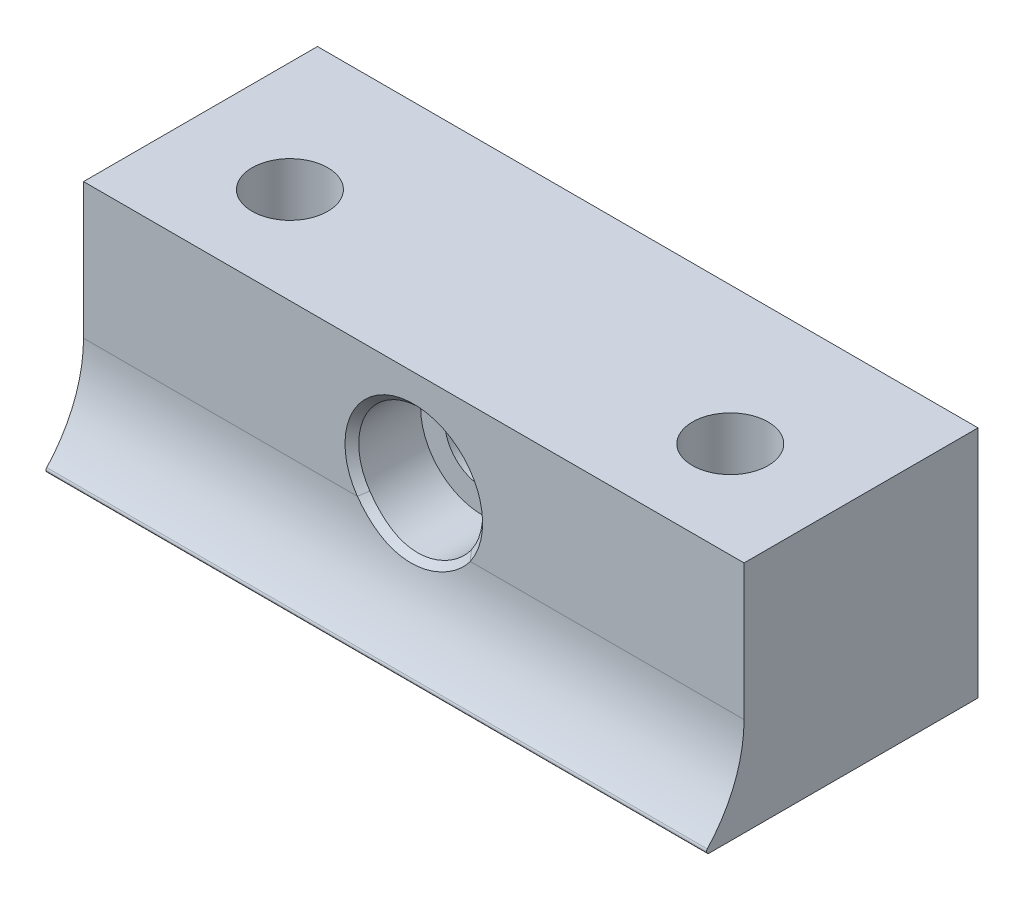
ISO-10303-21;
HEADER;
FILE_DESCRIPTION(('STEP AP214'),'2;1');
FILE_NAME('part.step','',(''),(''),'','','');
FILE_SCHEMA(('AUTOMOTIVE_DESIGN { 1 0 10303 214 1 1 1 1 }'));
ENDSEC;
DATA;
#1=APPLICATION_CONTEXT('core data for automotive mechanical design processes');
#2=APPLICATION_PROTOCOL_DEFINITION('international standard','automotive_design',2000,#1);
#3=PRODUCT_CONTEXT('',#1,'mechanical');
#4=PRODUCT('Part','Part','',(#3));
#5=PRODUCT_RELATED_PRODUCT_CATEGORY('part','',(#4));
#6=PRODUCT_DEFINITION_FORMATION('','',#4);
#7=PRODUCT_DEFINITION_CONTEXT('part definition',#1,'design');
#8=PRODUCT_DEFINITION('design','',#6,#7);
#9=PRODUCT_DEFINITION_SHAPE('','',#8);
#10=(LENGTH_UNIT() NAMED_UNIT(*) SI_UNIT(.MILLI.,.METRE.));
#11=(NAMED_UNIT(*) PLANE_ANGLE_UNIT() SI_UNIT($,.RADIAN.));
#12=(NAMED_UNIT(*) SI_UNIT($,.STERADIAN.) SOLID_ANGLE_UNIT());
#13=UNCERTAINTY_MEASURE_WITH_UNIT(LENGTH_MEASURE(1.E-05),#10,'distance_accuracy_value','');
#14=(GEOMETRIC_REPRESENTATION_CONTEXT(3) GLOBAL_UNCERTAINTY_ASSIGNED_CONTEXT((#13)) GLOBAL_UNIT_ASSIGNED_CONTEXT((#10,
#11,#12)) REPRESENTATION_CONTEXT('',''));
#15=CARTESIAN_POINT('',(0.,0.,0.));
#16=DIRECTION('',(0.,0.,1.));
#17=DIRECTION('',(1.,0.,0.));
#18=AXIS2_PLACEMENT_3D('',#15,#16,#17);
#19=CARTESIAN_POINT('',(0.,-1.35786437626905,17.));
#20=DIRECTION('',(-1.,0.,0.));
#21=DIRECTION('',(0.,0.,1.));
#22=AXIS2_PLACEMENT_3D('',#19,#20,#21);
#23=CYLINDRICAL_SURFACE('',#22,10.);
#24=DIRECTION('',(1.,0.,0.));
#25=VECTOR('',#24,1.);
#26=CARTESIAN_POINT('',(0.,-1.35786437626905,7.));
#27=LINE('',#26,#25);
#28=CARTESIAN_POINT('',(28.102756537604,-1.35786437626905,7.));
#29=VERTEX_POINT('',#28);
#30=CARTESIAN_POINT('',(48.,-1.35786437626905,7.));
#31=VERTEX_POINT('',#30);
#32=EDGE_CURVE('E164',#29,#31,#27,.T.);
#33=ORIENTED_EDGE('',*,*,#32,.F.);
#34=CARTESIAN_POINT('',(19.897243462396,-1.35786437626905,7.));
#35=CARTESIAN_POINT('',(20.0130588959423,-1.51619497730604,7.00000304871099));
#36=CARTESIAN_POINT('',(20.1379536469672,-1.66653208227593,7.00374655382849));
#37=CARTESIAN_POINT('',(20.3386090898688,-1.88038126026735,7.01340540169242));
#38=CARTESIAN_POINT('',(20.4077173317841,-1.94971783281976,7.01730146128937));
#39=CARTESIAN_POINT('',(20.5147295110078,-2.05079798637389,7.02397958623535));
#40=CARTESIAN_POINT('',(20.550958859625,-2.0840036376359,7.0263447892878));
#41=CARTESIAN_POINT('',(20.62454204696,-2.14943453477146,7.03132440117944));
#42=CARTESIAN_POINT('',(20.6618982598094,-2.18166125117809,7.03393902676495));
#43=CARTESIAN_POINT('',(20.7377360210311,-2.24512076744852,7.0393879764549));
#44=CARTESIAN_POINT('',(20.776265241529,-2.27638713093091,7.04222610369134));
#45=CARTESIAN_POINT('',(20.8539617809433,-2.33752910054113,7.04805555840096));
#46=CARTESIAN_POINT('',(20.8932292825558,-2.367490126291,7.0510539844929));
#47=CARTESIAN_POINT('',(21.012123709398,-2.45543990905693,7.06024149938875));
#48=CARTESIAN_POINT('',(21.0929803389999,-2.51161340454521,7.06663255523604));
#49=CARTESIAN_POINT('',(21.3400507947284,-2.67271203492674,7.08622764872528));
#50=CARTESIAN_POINT('',(21.510958894191,-2.77039627591627,7.09986611432279));
#51=CARTESIAN_POINT('',(21.7764429264665,-2.90226389514652,7.11987797074535));
#52=CARTESIAN_POINT('',(21.8665498085541,-2.943804268235,7.12648201266957));
#53=CARTESIAN_POINT('',(22.0039699710863,-3.0023572844467,7.13612472230417));
#54=CARTESIAN_POINT('',(22.0502087724551,-3.02126781169441,7.13929860708688));
#55=CARTESIAN_POINT('',(22.1434254579946,-3.05781178399382,7.14553283908427));
#56=CARTESIAN_POINT('',(22.1905217410927,-3.07548513701015,7.1486003633662));
#57=CARTESIAN_POINT('',(22.2848625501026,-3.10932373560039,7.15456021705894));
#58=CARTESIAN_POINT('',(22.3322165124596,-3.12553418871649,7.15746010949573));
#59=CARTESIAN_POINT('',(22.4272292204161,-3.156530006219,7.16307720697808));
#60=CARTESIAN_POINT('',(22.4748978497002,-3.17131944740946,7.1657951105624));
#61=CARTESIAN_POINT('',(22.6183872656966,-3.21358204023549,7.1736510523122));
#62=CARTESIAN_POINT('',(22.7146912192693,-3.23895116579321,7.17849085475904));
#63=CARTESIAN_POINT('',(22.9085805033188,-3.28413369483955,7.18725236108551));
#64=CARTESIAN_POINT('',(23.0061658539977,-3.30394698786849,7.19117417024828));
#65=CARTESIAN_POINT('',(23.2026237473585,-3.33801194597398,7.19799421649741));
#66=CARTESIAN_POINT('',(23.3014962626456,-3.35226372462158,7.20089250029148));
#67=CARTESIAN_POINT('',(23.4507845801708,-3.36941968043024,7.20440511228242));
#68=CARTESIAN_POINT('',(23.5007107005354,-3.37443428739581,7.20543696205583));
#69=CARTESIAN_POINT('',(23.6008933044549,-3.3830408647484,7.20721288430494));
#70=CARTESIAN_POINT('',(23.6511616879197,-3.38663298402814,7.20795697838543));
#71=CARTESIAN_POINT('',(23.7519857305589,-3.39237548869767,7.20914849819156));
#72=CARTESIAN_POINT('',(23.8026703868221,-3.3945273522476,7.20959622822922));
#73=CARTESIAN_POINT('',(23.9036528155211,-3.39735188999408,7.21018423302993));
#74=CARTESIAN_POINT('',(23.9540680579892,-3.3980376601367,7.2103272764546));
#75=CARTESIAN_POINT('',(24.205537015731,-3.39780800821491,7.21027917797543));
#76=CARTESIAN_POINT('',(24.4051780163672,-3.38613557872272,7.20782617655455));
#77=CARTESIAN_POINT('',(24.702285872543,-3.35174473722544,7.20078698381208));
#78=CARTESIAN_POINT('',(24.800935063586,-3.33746420055102,7.19788343597489));
#79=CARTESIAN_POINT('',(24.9974588269068,-3.30324656526025,7.19103509982529));
#80=CARTESIAN_POINT('',(25.0953413140095,-3.28330750012792,7.18708970587284));
#81=CARTESIAN_POINT('',(25.2415539284714,-3.24910052545916,7.18046026104175));
#82=CARTESIAN_POINT('',(25.2902107759442,-3.23697508482915,7.17813084667624));
#83=CARTESIAN_POINT('',(25.3872811380497,-3.21128481536983,7.17325059547748));
#84=CARTESIAN_POINT('',(25.435795079945,-3.19769003322368,7.17069419418164));
#85=CARTESIAN_POINT('',(25.5322891075388,-3.1691260634289,7.16539060040602));
#86=CARTESIAN_POINT('',(25.5801514873408,-3.15419531522305,7.16265045645268));
#87=CARTESIAN_POINT('',(25.6752189230991,-3.12302308474558,7.15700931551151));
#88=CARTESIAN_POINT('',(25.7224071399479,-3.10678674898562,7.15410927188811));
#89=CARTESIAN_POINT('',(25.8629487585439,-3.05614793109439,7.14520380859677));
#90=CARTESIAN_POINT('',(25.9552799433547,-3.01981725084033,7.13899272005257));
#91=CARTESIAN_POINT('',(26.1372639602929,-2.94207766102138,7.12620539935937));
#92=CARTESIAN_POINT('',(26.2269167161208,-2.90066862886112,7.11962900991663));
#93=CARTESIAN_POINT('',(26.4035620897863,-2.81277814078854,7.10630497699733));
#94=CARTESIAN_POINT('',(26.4905547301468,-2.76629676000176,7.09955712075014));
#95=CARTESIAN_POINT('',(26.661869003085,-2.66820949193007,7.08609835542596));
#96=CARTESIAN_POINT('',(26.7462036127491,-2.61659220176345,7.07938625120258));
#97=CARTESIAN_POINT('',(26.8706327948176,-2.53527314244865,7.06951869892984));
#98=CARTESIAN_POINT('',(26.9118094162403,-2.50748137924738,7.06625961464559));
#99=CARTESIAN_POINT('',(26.993337851374,-2.4506663034649,7.05984903661256));
#100=CARTESIAN_POINT('',(27.0335360974949,-2.42175201873425,7.05670967954788));
#101=CARTESIAN_POINT('',(27.1524548486036,-2.33349862087852,7.04753157274591));
#102=CARTESIAN_POINT('',(27.2296227971027,-2.27257889080848,7.04172279965492));
#103=CARTESIAN_POINT('',(27.3796385191993,-2.14675070160011,7.03096568628498));
#104=CARTESIAN_POINT('',(27.4525164713925,-2.08182316784007,7.02601467494817));
#105=CARTESIAN_POINT('',(27.5940477376481,-1.94796086255198,7.01720054576577));
#106=CARTESIAN_POINT('',(27.6627009715139,-1.87902604374914,7.01333694361434));
#107=CARTESIAN_POINT('',(27.8623055691313,-1.66617295050626,7.00374497712885));
#108=CARTESIAN_POINT('',(27.9869197830637,-1.51622347667655,7.00000368101554));
#109=CARTESIAN_POINT('',(28.102756537604,-1.35786437626905,7.));
#110=B_SPLINE_CURVE_WITH_KNOTS('',3,(#34,#35,#36,#37,#38,#39,#40,#41,#42,#43,#44,#45,#46,#47,
#48,#49,#50,#51,#52,#53,#54,#55,#56,#57,#58,#59,#60,#61,#62,#63,#64,#65,#66,#67,#68,#69,#70,#71,
#72,#73,#74,#75,#76,#77,#78,#79,#80,#81,#82,#83,#84,#85,#86,#87,#88,#89,#90,#91,#92,#93,#94,#95,
#96,#97,#98,#99,#100,#101,#102,#103,#104,#105,#106,#107,#108,#109),.UNSPECIFIED.,.F.,.F.,(4,2,2,
2,2,2,2,2,2,2,2,2,2,2,2,2,2,2,2,2,2,2,2,2,2,2,2,2,2,2,2,2,2,2,2,2,2,4),(0.,0.000598980847890898,
0.000898471271836347,0.00104821648380907,0.0011979616957818,0.00134770690775452,
0.00149745211972724,0.00179694254367269,0.00239592339156359,0.00269541381550904,
0.00284515902748176,0.00299490423945449,0.00314464945142721,0.00329439466339994,
0.00359388508734539,0.00389337551129084,0.00419286593523628,0.00434261114720901,
0.00449235635918173,0.00464210157115446,0.00479184678312718,0.00539082763101808,
0.00569031805496353,0.00598980847890898,0.0061395536908817,0.00628929890285443,
0.00643904411482715,0.00658878932679987,0.00688827975074532,0.00718777017469077,
0.00748726059863622,0.00778675102258167,0.00793649623455439,0.00808624144652712,
0.00838573187047257,0.00868522229441802,0.00898471271836346,0.00958369356625436),.UNSPECIFIED.);
#111=CARTESIAN_POINT('',(19.897243462396,-1.35786437626905,7.));
#112=VERTEX_POINT('',#111);
#113=EDGE_CURVE('E60',#29,#112,#110,.F.);
#114=ORIENTED_EDGE('',*,*,#113,.T.);
#115=CARTESIAN_POINT('',(0.,-1.35786437626905,7.));
#116=VERTEX_POINT('',#115);
#117=EDGE_CURVE('E172',#116,#112,#27,.T.);
#118=ORIENTED_EDGE('',*,*,#117,.F.);
#119=CARTESIAN_POINT('',(0.,-1.35786437626905,17.));
#120=DIRECTION('',(-1.,0.,0.));
#121=DIRECTION('',(0.,0.,1.));
#122=AXIS2_PLACEMENT_3D('',#119,#120,#121);
#123=CIRCLE('',#122,10.);
#124=CARTESIAN_POINT('',(0.,-8.16387969365234,9.67346224335505));
#125=VERTEX_POINT('',#124);
#126=EDGE_CURVE('E127',#116,#125,#123,.T.);
#127=ORIENTED_EDGE('',*,*,#126,.T.);
#128=DIRECTION('',(-1.,0.,0.));
#129=VECTOR('',#128,1.);
#130=CARTESIAN_POINT('',(0.,-8.16387969365234,9.67346224335505));
#131=LINE('',#130,#129);
#132=CARTESIAN_POINT('',(48.,-8.16387969365234,9.67346224335505));
#133=VERTEX_POINT('',#132);
#134=EDGE_CURVE('E352',#125,#133,#131,.F.);
#135=ORIENTED_EDGE('',*,*,#134,.T.);
#136=CARTESIAN_POINT('',(48.,-1.35786437626905,17.));
#137=DIRECTION('',(-1.,0.,0.));
#138=DIRECTION('',(0.,0.,1.));
#139=AXIS2_PLACEMENT_3D('',#136,#137,#138);
#140=CIRCLE('',#139,10.);
#141=EDGE_CURVE('E357',#133,#31,#140,.F.);
#142=ORIENTED_EDGE('',*,*,#141,.T.);
#143=EDGE_LOOP('',(#33,#114,#118,#127,#135,#142));
#144=FACE_BOUND('',#143,.T.);
#145=ADVANCED_FACE('F47',(#144),#23,.F.);
#146=CARTESIAN_POINT('',(24.,1.5,-10.));
#147=DIRECTION('',(0.,0.,1.));
#148=DIRECTION('',(1.,0.,0.));
#149=AXIS2_PLACEMENT_3D('',#146,#147,#148);
#150=CYLINDRICAL_SURFACE('',#149,2.75);
#151=CARTESIAN_POINT('',(24.,1.5,-10.));
#152=DIRECTION('',(0.,0.,1.));
#153=DIRECTION('',(1.,0.,0.));
#154=AXIS2_PLACEMENT_3D('',#151,#152,#153);
#155=CIRCLE('',#154,2.75);
#156=CARTESIAN_POINT('',(26.75,1.5,-10.));
#157=VERTEX_POINT('',#156);
#158=EDGE_CURVE('E311',#157,#157,#155,.T.);
#159=ORIENTED_EDGE('',*,*,#158,.F.);
#160=EDGE_LOOP('',(#159));
#161=FACE_BOUND('',#160,.T.);
#162=CARTESIAN_POINT('',(24.,1.5,2.));
#163=DIRECTION('',(0.,0.,1.));
#164=DIRECTION('',(1.,0.,0.));
#165=AXIS2_PLACEMENT_3D('',#162,#163,#164);
#166=CIRCLE('',#165,2.75);
#167=CARTESIAN_POINT('',(26.75,1.5,2.));
#168=VERTEX_POINT('',#167);
#169=EDGE_CURVE('E302',#168,#168,#166,.F.);
#170=ORIENTED_EDGE('',*,*,#169,.F.);
#171=EDGE_LOOP('',(#170));
#172=FACE_BOUND('',#171,.T.);
#173=ADVANCED_FACE('F201',(#161,#172),#150,.F.);
#174=CARTESIAN_POINT('',(48.,-8.5,-10.));
#175=DIRECTION('',(0.,0.,1.));
#176=DIRECTION('',(1.,0.,0.));
#177=AXIS2_PLACEMENT_3D('',#174,#175,#176);
#178=PLANE('',#177);
#179=ORIENTED_EDGE('',*,*,#158,.T.);
#180=EDGE_LOOP('',(#179));
#181=FACE_BOUND('',#180,.T.);
#182=DIRECTION('',(0.,1.,0.));
#183=VECTOR('',#182,1.);
#184=CARTESIAN_POINT('',(0.,-8.5,-10.));
#185=LINE('',#184,#183);
#186=CARTESIAN_POINT('',(0.,-8.5,-10.));
#187=VERTEX_POINT('',#186);
#188=CARTESIAN_POINT('',(0.,8.5,-10.));
#189=VERTEX_POINT('',#188);
#190=EDGE_CURVE('E147',#187,#189,#185,.T.);
#191=ORIENTED_EDGE('',*,*,#190,.T.);
#192=DIRECTION('',(-1.,0.,0.));
#193=VECTOR('',#192,1.);
#194=CARTESIAN_POINT('',(48.,8.5,-10.));
#195=LINE('',#194,#193);
#196=CARTESIAN_POINT('',(48.,8.5,-10.));
#197=VERTEX_POINT('',#196);
#198=EDGE_CURVE('E143',#197,#189,#195,.T.);
#199=ORIENTED_EDGE('',*,*,#198,.F.);
#200=DIRECTION('',(0.,1.,0.));
#201=VECTOR('',#200,1.);
#202=CARTESIAN_POINT('',(48.,-8.5,-10.));
#203=LINE('',#202,#201);
#204=CARTESIAN_POINT('',(48.,-8.5,-10.));
#205=VERTEX_POINT('',#204);
#206=EDGE_CURVE('E151',#205,#197,#203,.T.);
#207=ORIENTED_EDGE('',*,*,#206,.F.);
#208=DIRECTION('',(-1.,0.,0.));
#209=VECTOR('',#208,1.);
#210=CARTESIAN_POINT('',(48.,-8.5,-10.));
#211=LINE('',#210,#209);
#212=EDGE_CURVE('E157',#205,#187,#211,.T.);
#213=ORIENTED_EDGE('',*,*,#212,.T.);
#214=EDGE_LOOP('',(#191,#199,#207,#213));
#215=FACE_BOUND('',#214,.T.);
#216=ADVANCED_FACE('F204',(#181,#215),#178,.F.);
#217=CARTESIAN_POINT('',(48.,8.5,10.));
#218=DIRECTION('',(0.,-1.,0.));
#219=DIRECTION('',(0.,0.,-1.));
#220=AXIS2_PLACEMENT_3D('',#217,#218,#219);
#221=PLANE('',#220);
#222=CARTESIAN_POINT('',(40.,8.5,0.));
#223=DIRECTION('',(0.,1.,0.));
#224=DIRECTION('',(0.,0.,-1.));
#225=AXIS2_PLACEMENT_3D('',#222,#223,#224);
#226=CIRCLE('',#225,2.75);
#227=CARTESIAN_POINT('',(40.,8.5,-2.75));
#228=VERTEX_POINT('',#227);
#229=EDGE_CURVE('E319',#228,#228,#226,.T.);
#230=ORIENTED_EDGE('',*,*,#229,.F.);
#231=EDGE_LOOP('',(#230));
#232=FACE_BOUND('',#231,.T.);
#233=CARTESIAN_POINT('',(8.,8.5,0.));
#234=DIRECTION('',(0.,-1.,0.));
#235=DIRECTION('',(0.,0.,-1.));
#236=AXIS2_PLACEMENT_3D('',#233,#234,#235);
#237=CIRCLE('',#236,2.75);
#238=CARTESIAN_POINT('',(8.,8.5,-2.75));
#239=VERTEX_POINT('',#238);
#240=EDGE_CURVE('E153',#239,#239,#237,.T.);
#241=ORIENTED_EDGE('',*,*,#240,.T.);
#242=EDGE_LOOP('',(#241));
#243=FACE_BOUND('',#242,.T.);
#244=DIRECTION('',(0.,0.,1.));
#245=VECTOR('',#244,1.);
#246=CARTESIAN_POINT('',(0.,8.5,10.));
#247=LINE('',#246,#245);
#248=CARTESIAN_POINT('',(0.,8.5,7.));
#249=VERTEX_POINT('',#248);
#250=EDGE_CURVE('E124',#189,#249,#247,.T.);
#251=ORIENTED_EDGE('',*,*,#250,.T.);
#252=DIRECTION('',(1.,0.,0.));
#253=VECTOR('',#252,1.);
#254=CARTESIAN_POINT('',(0.,8.5,7.));
#255=LINE('',#254,#253);
#256=CARTESIAN_POINT('',(48.,8.5,7.));
#257=VERTEX_POINT('',#256);
#258=EDGE_CURVE('E130',#249,#257,#255,.T.);
#259=ORIENTED_EDGE('',*,*,#258,.T.);
#260=DIRECTION('',(0.,0.,1.));
#261=VECTOR('',#260,1.);
#262=CARTESIAN_POINT('',(48.,8.5,10.));
#263=LINE('',#262,#261);
#264=EDGE_CURVE('E336',#197,#257,#263,.T.);
#265=ORIENTED_EDGE('',*,*,#264,.F.);
#266=ORIENTED_EDGE('',*,*,#198,.T.);
#267=EDGE_LOOP('',(#251,#259,#265,#266));
#268=FACE_BOUND('',#267,.T.);
#269=ADVANCED_FACE('F141',(#232,#243,#268),#221,.F.);
#270=CARTESIAN_POINT('',(48.,-8.5,10.));
#271=DIRECTION('',(0.,1.,0.));
#272=DIRECTION('',(0.,0.,1.));
#273=AXIS2_PLACEMENT_3D('',#270,#271,#272);
#274=PLANE('',#273);
#275=CARTESIAN_POINT('',(40.,-8.5,0.));
#276=DIRECTION('',(0.,1.,0.));
#277=DIRECTION('',(0.,0.,-1.));
#278=AXIS2_PLACEMENT_3D('',#275,#276,#277);
#279=CIRCLE('',#278,2.75);
#280=CARTESIAN_POINT('',(40.,-8.5,-2.75));
#281=VERTEX_POINT('',#280);
#282=EDGE_CURVE('E139',#281,#281,#279,.T.);
#283=ORIENTED_EDGE('',*,*,#282,.T.);
#284=EDGE_LOOP('',(#283));
#285=FACE_BOUND('',#284,.T.);
#286=CARTESIAN_POINT('',(8.,-8.5,0.));
#287=DIRECTION('',(0.,-1.,0.));
#288=DIRECTION('',(0.,0.,-1.));
#289=AXIS2_PLACEMENT_3D('',#286,#287,#288);
#290=CIRCLE('',#289,2.75);
#291=CARTESIAN_POINT('',(8.,-8.5,-2.75));
#292=VERTEX_POINT('',#291);
#293=EDGE_CURVE('E323',#292,#292,#290,.T.);
#294=ORIENTED_EDGE('',*,*,#293,.F.);
#295=EDGE_LOOP('',(#294));
#296=FACE_BOUND('',#295,.T.);
#297=DIRECTION('',(0.,0.,-1.));
#298=VECTOR('',#297,1.);
#299=CARTESIAN_POINT('',(48.,-8.5,10.));
#300=LINE('',#299,#298);
#301=CARTESIAN_POINT('',(48.,-8.5,9.52693148822215));
#302=VERTEX_POINT('',#301);
#303=EDGE_CURVE('E161',#302,#205,#300,.T.);
#304=ORIENTED_EDGE('',*,*,#303,.F.);
#305=DIRECTION('',(-1.,0.,0.));
#306=VECTOR('',#305,1.);
#307=CARTESIAN_POINT('',(48.,-8.5,9.52693148822215));
#308=LINE('',#307,#306);
#309=CARTESIAN_POINT('',(0.,-8.5,9.52693148822215));
#310=VERTEX_POINT('',#309);
#311=EDGE_CURVE('E353',#302,#310,#308,.T.);
#312=ORIENTED_EDGE('',*,*,#311,.T.);
#313=DIRECTION('',(0.,0.,-1.));
#314=VECTOR('',#313,1.);
#315=CARTESIAN_POINT('',(0.,-8.5,10.));
#316=LINE('',#315,#314);
#317=EDGE_CURVE('E146',#310,#187,#316,.T.);
#318=ORIENTED_EDGE('',*,*,#317,.T.);
#319=ORIENTED_EDGE('',*,*,#212,.F.);
#320=EDGE_LOOP('',(#304,#312,#318,#319));
#321=FACE_BOUND('',#320,.T.);
#322=ADVANCED_FACE('F219',(#285,#296,#321),#274,.F.);
#323=CARTESIAN_POINT('',(48.,0.,0.));
#324=DIRECTION('',(-1.,0.,0.));
#325=DIRECTION('',(0.,0.,1.));
#326=AXIS2_PLACEMENT_3D('',#323,#324,#325);
#327=PLANE('',#326);
#328=ORIENTED_EDGE('',*,*,#141,.F.);
#329=CARTESIAN_POINT('',(48.,-8.3,9.52693148822215));
#330=DIRECTION('',(-1.,0.,0.));
#331=DIRECTION('',(0.,0.,1.));
#332=AXIS2_PLACEMENT_3D('',#329,#330,#331);
#333=CIRCLE('',#332,0.2);
#334=EDGE_CURVE('E181',#133,#302,#333,.F.);
#335=ORIENTED_EDGE('',*,*,#334,.T.);
#336=ORIENTED_EDGE('',*,*,#303,.T.);
#337=ORIENTED_EDGE('',*,*,#206,.T.);
#338=ORIENTED_EDGE('',*,*,#264,.T.);
#339=DIRECTION('',(0.,1.,0.));
#340=VECTOR('',#339,1.);
#341=CARTESIAN_POINT('',(48.,8.5,7.));
#342=LINE('',#341,#340);
#343=EDGE_CURVE('E131',#31,#257,#342,.T.);
#344=ORIENTED_EDGE('',*,*,#343,.F.);
#345=EDGE_LOOP('',(#328,#335,#336,#337,#338,#344));
#346=FACE_BOUND('',#345,.T.);
#347=ADVANCED_FACE('F216',(#346),#327,.F.);
#348=CARTESIAN_POINT('',(0.,0.,0.));
#349=DIRECTION('',(-1.,0.,0.));
#350=DIRECTION('',(0.,0.,1.));
#351=AXIS2_PLACEMENT_3D('',#348,#349,#350);
#352=PLANE('',#351);
#353=ORIENTED_EDGE('',*,*,#317,.F.);
#354=CARTESIAN_POINT('',(0.,-8.3,9.52693148822215));
#355=DIRECTION('',(-1.,0.,0.));
#356=DIRECTION('',(0.,0.,1.));
#357=AXIS2_PLACEMENT_3D('',#354,#355,#356);
#358=CIRCLE('',#357,0.2);
#359=EDGE_CURVE('E348',#310,#125,#358,.T.);
#360=ORIENTED_EDGE('',*,*,#359,.T.);
#361=ORIENTED_EDGE('',*,*,#126,.F.);
#362=DIRECTION('',(0.,1.,0.));
#363=VECTOR('',#362,1.);
#364=CARTESIAN_POINT('',(0.,8.5,7.));
#365=LINE('',#364,#363);
#366=EDGE_CURVE('E118',#116,#249,#365,.T.);
#367=ORIENTED_EDGE('',*,*,#366,.T.);
#368=ORIENTED_EDGE('',*,*,#250,.F.);
#369=ORIENTED_EDGE('',*,*,#190,.F.);
#370=EDGE_LOOP('',(#353,#360,#361,#367,#368,#369));
#371=FACE_BOUND('',#370,.T.);
#372=ADVANCED_FACE('F121',(#371),#352,.T.);
#373=CARTESIAN_POINT('',(8.,8.5,0.));
#374=DIRECTION('',(0.,-1.,0.));
#375=DIRECTION('',(0.,0.,-1.));
#376=AXIS2_PLACEMENT_3D('',#373,#374,#375);
#377=CYLINDRICAL_SURFACE('',#376,2.75);
#378=ORIENTED_EDGE('',*,*,#240,.F.);
#379=EDGE_LOOP('',(#378));
#380=FACE_BOUND('',#379,.T.);
#381=ORIENTED_EDGE('',*,*,#293,.T.);
#382=EDGE_LOOP('',(#381));
#383=FACE_BOUND('',#382,.T.);
#384=ADVANCED_FACE('F211',(#380,#383),#377,.F.);
#385=CARTESIAN_POINT('',(40.,8.5,0.));
#386=DIRECTION('',(0.,-1.,0.));
#387=DIRECTION('',(0.,0.,-1.));
#388=AXIS2_PLACEMENT_3D('',#385,#386,#387);
#389=CYLINDRICAL_SURFACE('',#388,2.75);
#390=ORIENTED_EDGE('',*,*,#229,.T.);
#391=EDGE_LOOP('',(#390));
#392=FACE_BOUND('',#391,.T.);
#393=ORIENTED_EDGE('',*,*,#282,.F.);
#394=EDGE_LOOP('',(#393));
#395=FACE_BOUND('',#394,.T.);
#396=ADVANCED_FACE('F208',(#392,#395),#389,.F.);
#397=CARTESIAN_POINT('',(0.,8.5,7.));
#398=DIRECTION('',(0.,0.,-1.));
#399=DIRECTION('',(0.,1.,0.));
#400=AXIS2_PLACEMENT_3D('',#397,#398,#399);
#401=PLANE('',#400);
#402=ORIENTED_EDGE('',*,*,#117,.T.);
#403=CARTESIAN_POINT('',(24.,1.5,7.));
#404=DIRECTION('',(0.,0.,-1.));
#405=DIRECTION('',(0.,1.,0.));
#406=AXIS2_PLACEMENT_3D('',#403,#404,#405);
#407=CIRCLE('',#406,5.00000000000001);
#408=EDGE_CURVE('E11',#112,#29,#407,.T.);
#409=ORIENTED_EDGE('',*,*,#408,.T.);
#410=ORIENTED_EDGE('',*,*,#32,.T.);
#411=ORIENTED_EDGE('',*,*,#343,.T.);
#412=ORIENTED_EDGE('',*,*,#258,.F.);
#413=ORIENTED_EDGE('',*,*,#366,.F.);
#414=EDGE_LOOP('',(#402,#409,#410,#411,#412,#413));
#415=FACE_BOUND('',#414,.T.);
#416=ADVANCED_FACE('F134',(#415),#401,.F.);
#417=CARTESIAN_POINT('',(0.,-8.3,9.52693148822215));
#418=DIRECTION('',(-1.,0.,0.));
#419=DIRECTION('',(0.,0.,1.));
#420=AXIS2_PLACEMENT_3D('',#417,#418,#419);
#421=CYLINDRICAL_SURFACE('',#420,0.2);
#422=ORIENTED_EDGE('',*,*,#334,.F.);
#423=ORIENTED_EDGE('',*,*,#134,.F.);
#424=ORIENTED_EDGE('',*,*,#359,.F.);
#425=ORIENTED_EDGE('',*,*,#311,.F.);
#426=EDGE_LOOP('',(#422,#423,#424,#425));
#427=FACE_BOUND('',#426,.T.);
#428=ADVANCED_FACE('F199',(#427),#421,.T.);
#429=CARTESIAN_POINT('',(24.,1.5,9.72693148822215));
#430=DIRECTION('',(0.,0.,-1.));
#431=DIRECTION('',(-1.,0.,0.));
#432=AXIS2_PLACEMENT_3D('',#429,#430,#431);
#433=CYLINDRICAL_SURFACE('',#432,4.5);
#434=CARTESIAN_POINT('',(24.,1.5,6.49999999999999));
#435=DIRECTION('',(0.,0.,-1.));
#436=DIRECTION('',(-1.,0.,0.));
#437=AXIS2_PLACEMENT_3D('',#434,#435,#436);
#438=CIRCLE('',#437,4.5);
#439=CARTESIAN_POINT('',(27.6924808838436,-1.07207793864214,6.49999999999999));
#440=VERTEX_POINT('',#439);
#441=CARTESIAN_POINT('',(20.3075191161564,-1.07207793864214,6.49999999999999));
#442=VERTEX_POINT('',#441);
#443=EDGE_CURVE('E177',#440,#442,#438,.F.);
#444=ORIENTED_EDGE('',*,*,#443,.T.);
#445=CARTESIAN_POINT('',(27.6924808838436,-1.07207793864214,6.49999999999999));
#446=CARTESIAN_POINT('',(27.5882278047573,-1.22172728852723,6.50000386506631));
#447=CARTESIAN_POINT('',(27.4760750122195,-1.36342954129483,6.50393222598521));
#448=CARTESIAN_POINT('',(27.2964308743618,-1.56457571441157,6.51400379079508));
#449=CARTESIAN_POINT('',(27.2346429638833,-1.62971911817949,6.51806057305405));
#450=CARTESIAN_POINT('',(27.1072648242532,-1.75621899667677,6.52731540869557));
#451=CARTESIAN_POINT('',(27.0416746672794,-1.81757551607997,6.53251397059922));
#452=CARTESIAN_POINT('',(26.9066605173924,-1.93648315488192,6.54380893963766));
#453=CARTESIAN_POINT('',(26.8372093637446,-1.99405229979703,6.54990815138307));
#454=CARTESIAN_POINT('',(26.7301824877447,-2.07745176077228,6.55954516352533));
#455=CARTESIAN_POINT('',(26.6940040662366,-2.10477575984222,6.56284148844318));
#456=CARTESIAN_POINT('',(26.6206284746163,-2.15846600645666,6.56957259537786));
#457=CARTESIAN_POINT('',(26.5835695153365,-2.18472922268138,6.57299463387626));
#458=CARTESIAN_POINT('',(26.4715832514727,-2.26157573373531,6.58335556376283));
#459=CARTESIAN_POINT('',(26.3956821027766,-2.31035407294173,6.59040327319724));
#460=CARTESIAN_POINT('',(26.241499257132,-2.40304654126961,6.60453497678765));
#461=CARTESIAN_POINT('',(26.1632058808078,-2.446971446113,6.61162022584718));
#462=CARTESIAN_POINT('',(26.0042250445086,-2.5300279573417,6.62561046041246));
#463=CARTESIAN_POINT('',(25.9235375642637,-2.56915949273304,6.63251566932732));
#464=CARTESIAN_POINT('',(25.7597519490191,-2.64262340511205,6.6459423560552));
#465=CARTESIAN_POINT('',(25.6766538826896,-2.67695589795205,6.65246399902659));
#466=CARTESIAN_POINT('',(25.550166425953,-2.72480958085931,6.66181473548251));
#467=CARTESIAN_POINT('',(25.5076970307892,-2.74015291815245,6.66485978128707));
#468=CARTESIAN_POINT('',(25.4221363386067,-2.76961067595367,6.6707829792753));
#469=CARTESIAN_POINT('',(25.3790601967849,-2.78372023300819,6.67366013042631));
#470=CARTESIAN_POINT('',(25.2922155719505,-2.81071318446427,6.67922890389071));
#471=CARTESIAN_POINT('',(25.2485530242448,-2.82356025359236,6.68191312525134));
#472=CARTESIAN_POINT('',(25.1611896983498,-2.84783755823144,6.68703738901005));
#473=CARTESIAN_POINT('',(25.1173985356243,-2.85929609962677,6.68948327409382));
#474=CARTESIAN_POINT('',(24.9858071826084,-2.89162169068881,6.69644419116649));
#475=CARTESIAN_POINT('',(24.8977129442163,-2.91046410723879,6.70058685481654));
#476=CARTESIAN_POINT('',(24.7208415572272,-2.94279977258864,6.70777760777363));
#477=CARTESIAN_POINT('',(24.6320572852965,-2.95629487974498,6.71082633300246));
#478=CARTESIAN_POINT('',(24.3646602147149,-2.98879422496275,6.7182174853827));
#479=CARTESIAN_POINT('',(24.18498331425,-2.99982467083088,6.72079313687417));
#480=CARTESIAN_POINT('',(23.9586612521672,-3.00004169189709,6.72084364027733));
#481=CARTESIAN_POINT('',(23.9132875339693,-2.9993936391123,6.72069344468142));
#482=CARTESIAN_POINT('',(23.8224033481396,-2.99672445094186,6.72007603964067));
#483=CARTESIAN_POINT('',(23.7767871575033,-2.9946909398872,6.71960592310114));
#484=CARTESIAN_POINT('',(23.6860455191274,-2.98926427297446,6.71835482730469));
#485=CARTESIAN_POINT('',(23.6408039740094,-2.98586972025512,6.71757352852018));
#486=CARTESIAN_POINT('',(23.5506396304819,-2.97773650465693,6.71570881015861));
#487=CARTESIAN_POINT('',(23.5057061221537,-2.97299770107447,6.71462536789653));
#488=CARTESIAN_POINT('',(23.371346636381,-2.95678532283526,6.71093712530604));
#489=CARTESIAN_POINT('',(23.2823613726228,-2.94331739201333,6.70789392732228));
#490=CARTESIAN_POINT('',(23.1055492685978,-2.91112600660357,6.70073287876068));
#491=CARTESIAN_POINT('',(23.0177224529871,-2.8924024446913,6.69661497913979));
#492=CARTESIAN_POINT('',(22.8432220973422,-2.84970495474243,6.68741539749698));
#493=CARTESIAN_POINT('',(22.756548539127,-2.82573113109046,6.68233360492781));
#494=CARTESIAN_POINT('',(22.6274080647302,-2.78579298086981,6.67408486609051));
#495=CARTESIAN_POINT('',(22.5845062983745,-2.77181695894484,6.67123106732697));
#496=CARTESIAN_POINT('',(22.4989948612137,-2.74252591140497,6.66533311497051));
#497=CARTESIAN_POINT('',(22.4563762950925,-2.72720703321031,6.66228822791189));
#498=CARTESIAN_POINT('',(22.3714695669833,-2.69522955754242,6.6560303815345));
#499=CARTESIAN_POINT('',(22.3290829121953,-2.6785282389421,6.65280948103849));
#500=CARTESIAN_POINT('',(22.2451878952094,-2.64399418511905,6.64626353744121));
#501=CARTESIAN_POINT('',(22.2035729739783,-2.62612373687031,6.64293095841943));
#502=CARTESIAN_POINT('',(22.0798948276973,-2.57079113654937,6.63280611330293));
#503=CARTESIAN_POINT('',(21.9987986338216,-2.53153548398226,6.62587186928276));
#504=CARTESIAN_POINT('',(21.7598630047684,-2.40692058380695,6.60485942003862));
#505=CARTESIAN_POINT('',(21.6060457152594,-2.31460897607629,6.59053903116189));
#506=CARTESIAN_POINT('',(21.383682305098,-2.1623707703618,6.56996418299765));
#507=CARTESIAN_POINT('',(21.3109113384583,-2.10928681712682,6.56325357435819));
#508=CARTESIAN_POINT('',(21.2039063543001,-2.02617427241282,6.55360668371753));
#509=CARTESIAN_POINT('',(21.168565602849,-1.99786110307928,6.550458336321));
#510=CARTESIAN_POINT('',(21.0986387173761,-1.94008194179757,6.54433740887589));
#511=CARTESIAN_POINT('',(21.063962418928,-1.91053522830675,6.54135737527764));
#512=CARTESIAN_POINT('',(20.9957084338284,-1.85056598543117,6.53563597810318));
#513=CARTESIAN_POINT('',(20.962087842264,-1.82011173842691,6.5328906212384));
#514=CARTESIAN_POINT('',(20.8958629736625,-1.75827954063381,6.52766202875218));
#515=CARTESIAN_POINT('',(20.8632565599071,-1.72690020019121,6.52517856554711));
#516=CARTESIAN_POINT('',(20.7669455986057,-1.63137945508255,6.51816653435383));
#517=CARTESIAN_POINT('',(20.7047481808822,-1.56585639402083,6.51407567177705));
#518=CARTESIAN_POINT('',(20.52415828227,-1.36376892081806,6.50393388151988));
#519=CARTESIAN_POINT('',(20.4117530063481,-1.2217003566221,6.50000320114653));
#520=CARTESIAN_POINT('',(20.3075191161564,-1.07207793864214,6.5));
#521=B_SPLINE_CURVE_WITH_KNOTS('',3,(#445,#446,#447,#448,#449,#450,#451,#452,#453,#454,#455,
#456,#457,#458,#459,#460,#461,#462,#463,#464,#465,#466,#467,#468,#469,#470,#471,#472,#473,#474,
#475,#476,#477,#478,#479,#480,#481,#482,#483,#484,#485,#486,#487,#488,#489,#490,#491,#492,#493,
#494,#495,#496,#497,#498,#499,#500,#501,#502,#503,#504,#505,#506,#507,#508,#509,#510,#511,#512,
#513,#514,#515,#516,#517,#518,#519,#520),.UNSPECIFIED.,.F.,.F.,(4,2,2,2,2,2,2,2,2,2,2,2,2,2,2,2,
2,2,2,2,2,2,2,2,2,2,2,2,2,2,2,2,2,2,2,2,2,4),(0.,0.000598980847890899,0.000898471271836346,
0.0011979616957818,0.00149745211972725,0.00164719733169997,0.00179694254367269,
0.00209643296761814,0.00239592339156359,0.00269541381550904,0.00299490423945449,
0.00314464945142721,0.00329439466339994,0.00344413987537266,0.00359388508734539,
0.00389337551129084,0.00419286593523628,0.00479184678312718,0.00494159199509991,
0.00509133720707263,0.00524108241904536,0.00539082763101808,0.00569031805496353,
0.00598980847890898,0.00628929890285443,0.00643904411482715,0.00658878932679987,
0.0067385345387726,0.00688827975074532,0.00718777017469077,0.00778675102258167,
0.00808624144652712,0.00823598665849984,0.00838573187047257,0.00853547708244529,
0.00868522229441802,0.00898471271836347,0.00958369356625436),.UNSPECIFIED.);
#522=EDGE_CURVE('E180',#442,#440,#521,.F.);
#523=ORIENTED_EDGE('',*,*,#522,.T.);
#524=EDGE_LOOP('',(#444,#523));
#525=FACE_BOUND('',#524,.T.);
#526=CARTESIAN_POINT('',(24.,1.5,2.));
#527=DIRECTION('',(0.,0.,1.));
#528=DIRECTION('',(1.,0.,0.));
#529=AXIS2_PLACEMENT_3D('',#526,#527,#528);
#530=CIRCLE('',#529,4.5);
#531=CARTESIAN_POINT('',(28.5,1.5,2.));
#532=VERTEX_POINT('',#531);
#533=EDGE_CURVE('E305',#532,#532,#530,.T.);
#534=ORIENTED_EDGE('',*,*,#533,.F.);
#535=EDGE_LOOP('',(#534));
#536=FACE_BOUND('',#535,.T.);
#537=ADVANCED_FACE('F188',(#525,#536),#433,.F.);
#538=CARTESIAN_POINT('',(0.,0.,2.));
#539=DIRECTION('',(0.,0.,1.));
#540=DIRECTION('',(1.,0.,0.));
#541=AXIS2_PLACEMENT_3D('',#538,#539,#540);
#542=PLANE('',#541);
#543=ORIENTED_EDGE('',*,*,#169,.T.);
#544=EDGE_LOOP('',(#543));
#545=FACE_BOUND('',#544,.T.);
#546=ORIENTED_EDGE('',*,*,#533,.T.);
#547=EDGE_LOOP('',(#546));
#548=FACE_BOUND('',#547,.T.);
#549=ADVANCED_FACE('F198',(#545,#548),#542,.T.);
#550=CARTESIAN_POINT('',(24.,1.5,6.49999999999999));
#551=DIRECTION('',(0.,0.,1.));
#552=DIRECTION('',(1.,0.,0.));
#553=AXIS2_PLACEMENT_3D('',#550,#551,#552);
#554=CONICAL_SURFACE('',#553,4.5,0.785398163397453);
#555=CARTESIAN_POINT('',(28.102756537604,-1.35786437626905,7.));
#556=CARTESIAN_POINT('',(27.6924808838436,-1.07207793864214,6.49999999999999));
#557=B_SPLINE_CURVE_WITH_KNOTS('',1,(#555,#556),.UNSPECIFIED.,.F.,.F.,(2,2),(0.,1.),.UNSPECIFIED.);
#558=EDGE_CURVE('E250',#29,#440,#557,.T.);
#559=ORIENTED_EDGE('',*,*,#558,.F.);
#560=ORIENTED_EDGE('',*,*,#408,.F.);
#561=CARTESIAN_POINT('',(20.3075191161564,-1.07207793864214,6.5));
#562=CARTESIAN_POINT('',(19.897243462396,-1.35786437626905,7.));
#563=B_SPLINE_CURVE_WITH_KNOTS('',1,(#561,#562),.UNSPECIFIED.,.F.,.F.,(2,2),(0.,1.),.UNSPECIFIED.);
#564=EDGE_CURVE('E74',#442,#112,#563,.T.);
#565=ORIENTED_EDGE('',*,*,#564,.F.);
#566=ORIENTED_EDGE('',*,*,#443,.F.);
#567=EDGE_LOOP('',(#559,#560,#565,#566));
#568=FACE_BOUND('',#567,.T.);
#569=ADVANCED_FACE('F50',(#568),#554,.F.);
#570=CARTESIAN_POINT('',(20.3075191161564,-1.07207793864214,6.5));
#571=CARTESIAN_POINT('',(20.4117530063481,-1.2217003566221,6.50000320114653));
#572=CARTESIAN_POINT('',(20.52415828227,-1.36376892081806,6.50393388151988));
#573=CARTESIAN_POINT('',(20.7047481808822,-1.56585639402083,6.51407567177705));
#574=CARTESIAN_POINT('',(20.7669455986057,-1.63137945508255,6.51816653435383));
#575=CARTESIAN_POINT('',(20.8632565599071,-1.72690020019121,6.52517856554711));
#576=CARTESIAN_POINT('',(20.8958629736625,-1.75827954063381,6.52766202875218));
#577=CARTESIAN_POINT('',(20.962087842264,-1.82011173842691,6.5328906212384));
#578=CARTESIAN_POINT('',(20.9957084338284,-1.85056598543117,6.53563597810318));
#579=CARTESIAN_POINT('',(21.063962418928,-1.91053522830675,6.54135737527764));
#580=CARTESIAN_POINT('',(21.0986387173761,-1.94008194179757,6.54433740887589));
#581=CARTESIAN_POINT('',(21.168565602849,-1.99786110307928,6.550458336321));
#582=CARTESIAN_POINT('',(21.2039063543001,-2.02617427241282,6.55360668371753));
#583=CARTESIAN_POINT('',(21.3109113384583,-2.10928681712682,6.56325357435819));
#584=CARTESIAN_POINT('',(21.383682305098,-2.1623707703618,6.56996418299765));
#585=CARTESIAN_POINT('',(21.6060457152594,-2.31460897607629,6.59053903116189));
#586=CARTESIAN_POINT('',(21.7598630047684,-2.40692058380695,6.60485942003862));
#587=CARTESIAN_POINT('',(21.9987986338216,-2.53153548398226,6.62587186928276));
#588=CARTESIAN_POINT('',(22.0798948276973,-2.57079113654937,6.63280611330293));
#589=CARTESIAN_POINT('',(22.2035729739783,-2.62612373687031,6.64293095841943));
#590=CARTESIAN_POINT('',(22.2451878952094,-2.64399418511905,6.64626353744121));
#591=CARTESIAN_POINT('',(22.3290829121953,-2.6785282389421,6.65280948103849));
#592=CARTESIAN_POINT('',(22.3714695669833,-2.69522955754242,6.6560303815345));
#593=CARTESIAN_POINT('',(22.4563762950925,-2.72720703321031,6.66228822791189));
#594=CARTESIAN_POINT('',(22.4989948612137,-2.74252591140497,6.66533311497051));
#595=CARTESIAN_POINT('',(22.5845062983745,-2.77181695894484,6.67123106732697));
#596=CARTESIAN_POINT('',(22.6274080647302,-2.78579298086981,6.67408486609051));
#597=CARTESIAN_POINT('',(22.756548539127,-2.82573113109046,6.68233360492781));
#598=CARTESIAN_POINT('',(22.8432220973422,-2.84970495474243,6.68741539749698));
#599=CARTESIAN_POINT('',(23.0177224529871,-2.8924024446913,6.69661497913979));
#600=CARTESIAN_POINT('',(23.1055492685978,-2.91112600660357,6.70073287876068));
#601=CARTESIAN_POINT('',(23.2823613726228,-2.94331739201333,6.70789392732228));
#602=CARTESIAN_POINT('',(23.371346636381,-2.95678532283526,6.71093712530604));
#603=CARTESIAN_POINT('',(23.5057061221537,-2.97299770107447,6.71462536789653));
#604=CARTESIAN_POINT('',(23.5506396304819,-2.97773650465693,6.71570881015861));
#605=CARTESIAN_POINT('',(23.6408039740094,-2.98586972025512,6.71757352852018));
#606=CARTESIAN_POINT('',(23.6860455191274,-2.98926427297446,6.71835482730469));
#607=CARTESIAN_POINT('',(23.7767871575033,-2.9946909398872,6.71960592310114));
#608=CARTESIAN_POINT('',(23.8224033481396,-2.99672445094186,6.72007603964067));
#609=CARTESIAN_POINT('',(23.9132875339693,-2.9993936391123,6.72069344468142));
#610=CARTESIAN_POINT('',(23.9586612521672,-3.00004169189709,6.72084364027733));
#611=CARTESIAN_POINT('',(24.18498331425,-2.99982467083088,6.72079313687417));
#612=CARTESIAN_POINT('',(24.3646602147149,-2.98879422496275,6.7182174853827));
#613=CARTESIAN_POINT('',(24.6320572852965,-2.95629487974498,6.71082633300246));
#614=CARTESIAN_POINT('',(24.7208415572272,-2.94279977258864,6.70777760777363));
#615=CARTESIAN_POINT('',(24.8977129442163,-2.91046410723879,6.70058685481654));
#616=CARTESIAN_POINT('',(24.9858071826084,-2.89162169068881,6.69644419116649));
#617=CARTESIAN_POINT('',(25.1173985356243,-2.85929609962677,6.68948327409382));
#618=CARTESIAN_POINT('',(25.1611896983498,-2.84783755823144,6.68703738901005));
#619=CARTESIAN_POINT('',(25.2485530242448,-2.82356025359236,6.68191312525134));
#620=CARTESIAN_POINT('',(25.2922155719505,-2.81071318446427,6.67922890389071));
#621=CARTESIAN_POINT('',(25.3790601967849,-2.78372023300819,6.67366013042631));
#622=CARTESIAN_POINT('',(25.4221363386067,-2.76961067595367,6.6707829792753));
#623=CARTESIAN_POINT('',(25.5076970307892,-2.74015291815245,6.66485978128707));
#624=CARTESIAN_POINT('',(25.550166425953,-2.72480958085931,6.66181473548251));
#625=CARTESIAN_POINT('',(25.6766538826896,-2.67695589795205,6.65246399902659));
#626=CARTESIAN_POINT('',(25.7597519490191,-2.64262340511205,6.6459423560552));
#627=CARTESIAN_POINT('',(25.9235375642637,-2.56915949273304,6.63251566932732));
#628=CARTESIAN_POINT('',(26.0042250445086,-2.5300279573417,6.62561046041246));
#629=CARTESIAN_POINT('',(26.1632058808078,-2.446971446113,6.61162022584718));
#630=CARTESIAN_POINT('',(26.241499257132,-2.40304654126961,6.60453497678765));
#631=CARTESIAN_POINT('',(26.3956821027766,-2.31035407294173,6.59040327319724));
#632=CARTESIAN_POINT('',(26.4715832514727,-2.26157573373531,6.58335556376283));
#633=CARTESIAN_POINT('',(26.5835695153365,-2.18472922268138,6.57299463387626));
#634=CARTESIAN_POINT('',(26.6206284746163,-2.15846600645666,6.56957259537786));
#635=CARTESIAN_POINT('',(26.6940040662366,-2.10477575984222,6.56284148844318));
#636=CARTESIAN_POINT('',(26.7301824877447,-2.07745176077228,6.55954516352533));
#637=CARTESIAN_POINT('',(26.8372093637446,-1.99405229979703,6.54990815138307));
#638=CARTESIAN_POINT('',(26.9066605173924,-1.93648315488192,6.54380893963766));
#639=CARTESIAN_POINT('',(27.0416746672794,-1.81757551607997,6.53251397059922));
#640=CARTESIAN_POINT('',(27.1072648242532,-1.75621899667677,6.52731540869557));
#641=CARTESIAN_POINT('',(27.2346429638833,-1.62971911817949,6.51806057305405));
#642=CARTESIAN_POINT('',(27.2964308743618,-1.56457571441157,6.51400379079508));
#643=CARTESIAN_POINT('',(27.4760750122195,-1.36342954129483,6.50393222598521));
#644=CARTESIAN_POINT('',(27.5882278047573,-1.22172728852723,6.50000386506631));
#645=CARTESIAN_POINT('',(27.6924808838436,-1.07207793864214,6.49999999999999));
#646=CARTESIAN_POINT('',(19.897243462396,-1.35786437626905,7.));
#647=CARTESIAN_POINT('',(20.0130588959423,-1.51619497730604,7.00000304871099));
#648=CARTESIAN_POINT('',(20.1379536469672,-1.66653208227593,7.00374655382849));
#649=CARTESIAN_POINT('',(20.3386090898688,-1.88038126026735,7.01340540169242));
#650=CARTESIAN_POINT('',(20.4077173317841,-1.94971783281976,7.01730146128937));
#651=CARTESIAN_POINT('',(20.5147295110078,-2.05079798637389,7.02397958623535));
#652=CARTESIAN_POINT('',(20.550958859625,-2.0840036376359,7.0263447892878));
#653=CARTESIAN_POINT('',(20.62454204696,-2.14943453477146,7.03132440117944));
#654=CARTESIAN_POINT('',(20.6618982598094,-2.18166125117809,7.03393902676495));
#655=CARTESIAN_POINT('',(20.7377360210311,-2.24512076744852,7.0393879764549));
#656=CARTESIAN_POINT('',(20.776265241529,-2.27638713093091,7.04222610369134));
#657=CARTESIAN_POINT('',(20.8539617809433,-2.33752910054113,7.04805555840096));
#658=CARTESIAN_POINT('',(20.8932292825558,-2.367490126291,7.0510539844929));
#659=CARTESIAN_POINT('',(21.012123709398,-2.45543990905693,7.06024149938875));
#660=CARTESIAN_POINT('',(21.0929803389999,-2.51161340454521,7.06663255523604));
#661=CARTESIAN_POINT('',(21.3400507947284,-2.67271203492674,7.08622764872528));
#662=CARTESIAN_POINT('',(21.510958894191,-2.77039627591627,7.09986611432279));
#663=CARTESIAN_POINT('',(21.7764429264665,-2.90226389514652,7.11987797074535));
#664=CARTESIAN_POINT('',(21.8665498085541,-2.943804268235,7.12648201266957));
#665=CARTESIAN_POINT('',(22.0039699710863,-3.0023572844467,7.13612472230417));
#666=CARTESIAN_POINT('',(22.0502087724551,-3.02126781169441,7.13929860708688));
#667=CARTESIAN_POINT('',(22.1434254579946,-3.05781178399382,7.14553283908427));
#668=CARTESIAN_POINT('',(22.1905217410927,-3.07548513701015,7.1486003633662));
#669=CARTESIAN_POINT('',(22.2848625501026,-3.10932373560039,7.15456021705894));
#670=CARTESIAN_POINT('',(22.3322165124596,-3.12553418871649,7.15746010949573));
#671=CARTESIAN_POINT('',(22.4272292204161,-3.156530006219,7.16307720697808));
#672=CARTESIAN_POINT('',(22.4748978497002,-3.17131944740946,7.1657951105624));
#673=CARTESIAN_POINT('',(22.6183872656966,-3.21358204023549,7.1736510523122));
#674=CARTESIAN_POINT('',(22.7146912192693,-3.23895116579321,7.17849085475904));
#675=CARTESIAN_POINT('',(22.9085805033188,-3.28413369483955,7.18725236108551));
#676=CARTESIAN_POINT('',(23.0061658539977,-3.30394698786849,7.19117417024828));
#677=CARTESIAN_POINT('',(23.2026237473585,-3.33801194597398,7.19799421649741));
#678=CARTESIAN_POINT('',(23.3014962626456,-3.35226372462158,7.20089250029148));
#679=CARTESIAN_POINT('',(23.4507845801708,-3.36941968043024,7.20440511228242));
#680=CARTESIAN_POINT('',(23.5007107005354,-3.37443428739581,7.20543696205583));
#681=CARTESIAN_POINT('',(23.6008933044549,-3.3830408647484,7.20721288430494));
#682=CARTESIAN_POINT('',(23.6511616879197,-3.38663298402814,7.20795697838543));
#683=CARTESIAN_POINT('',(23.7519857305589,-3.39237548869767,7.20914849819156));
#684=CARTESIAN_POINT('',(23.8026703868221,-3.3945273522476,7.20959622822922));
#685=CARTESIAN_POINT('',(23.9036528155211,-3.39735188999408,7.21018423302993));
#686=CARTESIAN_POINT('',(23.9540680579892,-3.3980376601367,7.2103272764546));
#687=CARTESIAN_POINT('',(24.205537015731,-3.39780800821491,7.21027917797543));
#688=CARTESIAN_POINT('',(24.4051780163672,-3.38613557872272,7.20782617655455));
#689=CARTESIAN_POINT('',(24.702285872543,-3.35174473722544,7.20078698381208));
#690=CARTESIAN_POINT('',(24.800935063586,-3.33746420055102,7.19788343597489));
#691=CARTESIAN_POINT('',(24.9974588269068,-3.30324656526025,7.19103509982529));
#692=CARTESIAN_POINT('',(25.0953413140095,-3.28330750012792,7.18708970587284));
#693=CARTESIAN_POINT('',(25.2415539284714,-3.24910052545916,7.18046026104175));
#694=CARTESIAN_POINT('',(25.2902107759442,-3.23697508482915,7.17813084667624));
#695=CARTESIAN_POINT('',(25.3872811380497,-3.21128481536983,7.17325059547748));
#696=CARTESIAN_POINT('',(25.435795079945,-3.19769003322368,7.17069419418164));
#697=CARTESIAN_POINT('',(25.5322891075388,-3.1691260634289,7.16539060040602));
#698=CARTESIAN_POINT('',(25.5801514873408,-3.15419531522305,7.16265045645268));
#699=CARTESIAN_POINT('',(25.6752189230991,-3.12302308474558,7.15700931551151));
#700=CARTESIAN_POINT('',(25.7224071399479,-3.10678674898562,7.15410927188811));
#701=CARTESIAN_POINT('',(25.8629487585439,-3.05614793109439,7.14520380859677));
#702=CARTESIAN_POINT('',(25.9552799433547,-3.01981725084033,7.13899272005257));
#703=CARTESIAN_POINT('',(26.1372639602929,-2.94207766102138,7.12620539935937));
#704=CARTESIAN_POINT('',(26.2269167161208,-2.90066862886112,7.11962900991663));
#705=CARTESIAN_POINT('',(26.4035620897863,-2.81277814078854,7.10630497699733));
#706=CARTESIAN_POINT('',(26.4905547301468,-2.76629676000176,7.09955712075014));
#707=CARTESIAN_POINT('',(26.661869003085,-2.66820949193007,7.08609835542596));
#708=CARTESIAN_POINT('',(26.7462036127491,-2.61659220176345,7.07938625120258));
#709=CARTESIAN_POINT('',(26.8706327948176,-2.53527314244865,7.06951869892984));
#710=CARTESIAN_POINT('',(26.9118094162403,-2.50748137924738,7.06625961464559));
#711=CARTESIAN_POINT('',(26.993337851374,-2.4506663034649,7.05984903661256));
#712=CARTESIAN_POINT('',(27.0335360974949,-2.42175201873425,7.05670967954788));
#713=CARTESIAN_POINT('',(27.1524548486036,-2.33349862087852,7.04753157274591));
#714=CARTESIAN_POINT('',(27.2296227971027,-2.27257889080848,7.04172279965492));
#715=CARTESIAN_POINT('',(27.3796385191993,-2.14675070160011,7.03096568628498));
#716=CARTESIAN_POINT('',(27.4525164713925,-2.08182316784007,7.02601467494817));
#717=CARTESIAN_POINT('',(27.5940477376481,-1.94796086255198,7.01720054576577));
#718=CARTESIAN_POINT('',(27.6627009715139,-1.87902604374914,7.01333694361434));
#719=CARTESIAN_POINT('',(27.8623055691313,-1.66617295050626,7.00374497712885));
#720=CARTESIAN_POINT('',(27.9869197830637,-1.51622347667655,7.00000368101554));
#721=CARTESIAN_POINT('',(28.102756537604,-1.35786437626905,7.));
#722=B_SPLINE_SURFACE_WITH_KNOTS('',1,3,((#570,#571,#572,#573,#574,#575,#576,#577,#578,#579,
#580,#581,#582,#583,#584,#585,#586,#587,#588,#589,#590,#591,#592,#593,#594,#595,#596,#597,#598,
#599,#600,#601,#602,#603,#604,#605,#606,#607,#608,#609,#610,#611,#612,#613,#614,#615,#616,#617,
#618,#619,#620,#621,#622,#623,#624,#625,#626,#627,#628,#629,#630,#631,#632,#633,#634,#635,#636,
#637,#638,#639,#640,#641,#642,#643,#644,#645),(#646,#647,#648,#649,#650,#651,#652,#653,#654,
#655,#656,#657,#658,#659,#660,#661,#662,#663,#664,#665,#666,#667,#668,#669,#670,#671,#672,#673,
#674,#675,#676,#677,#678,#679,#680,#681,#682,#683,#684,#685,#686,#687,#688,#689,#690,#691,#692,
#693,#694,#695,#696,#697,#698,#699,#700,#701,#702,#703,#704,#705,#706,#707,#708,#709,#710,#711,
#712,#713,#714,#715,#716,#717,#718,#719,#720,#721)),.UNSPECIFIED.,.F.,.F.,.F.,(2,2),(4,2,2,2,2,
2,2,2,2,2,2,2,2,2,2,2,2,2,2,2,2,2,2,2,2,2,2,2,2,2,2,2,2,2,2,2,2,4),(0.,1.),(0.,
0.000598980847890898,0.000898471271836347,0.00104821648380907,0.0011979616957818,
0.00134770690775452,0.00149745211972724,0.00179694254367269,0.00239592339156359,
0.00269541381550904,0.00284515902748176,0.00299490423945449,0.00314464945142721,
0.00329439466339994,0.00359388508734539,0.00389337551129084,0.00419286593523628,
0.00434261114720901,0.00449235635918173,0.00464210157115446,0.00479184678312718,
0.00539082763101808,0.00569031805496353,0.00598980847890898,0.0061395536908817,
0.00628929890285443,0.00643904411482715,0.00658878932679987,0.00688827975074532,
0.00718777017469077,0.00748726059863622,0.00778675102258167,0.00793649623455439,
0.00808624144652712,0.00838573187047257,0.00868522229441802,0.00898471271836346,
0.00958369356625436),.UNSPECIFIED.);
#723=ORIENTED_EDGE('',*,*,#564,.T.);
#724=ORIENTED_EDGE('',*,*,#113,.F.);
#725=ORIENTED_EDGE('',*,*,#558,.T.);
#726=ORIENTED_EDGE('',*,*,#522,.F.);
#727=EDGE_LOOP('',(#723,#724,#725,#726));
#728=FACE_BOUND('',#727,.T.);
#729=ADVANCED_FACE('F257',(#728),#722,.T.);
#730=CLOSED_SHELL('',(#145,#173,#216,#269,#322,#347,#372,#384,#396,#416,#428,#537,#549,#569,#729));
#731=MANIFOLD_SOLID_BREP('B2',#730);
#732=ADVANCED_BREP_SHAPE_REPRESENTATION('',(#18,#731),#14);
#733=SHAPE_DEFINITION_REPRESENTATION(#9,#732);
ENDSEC;
END-ISO-10303-21;
